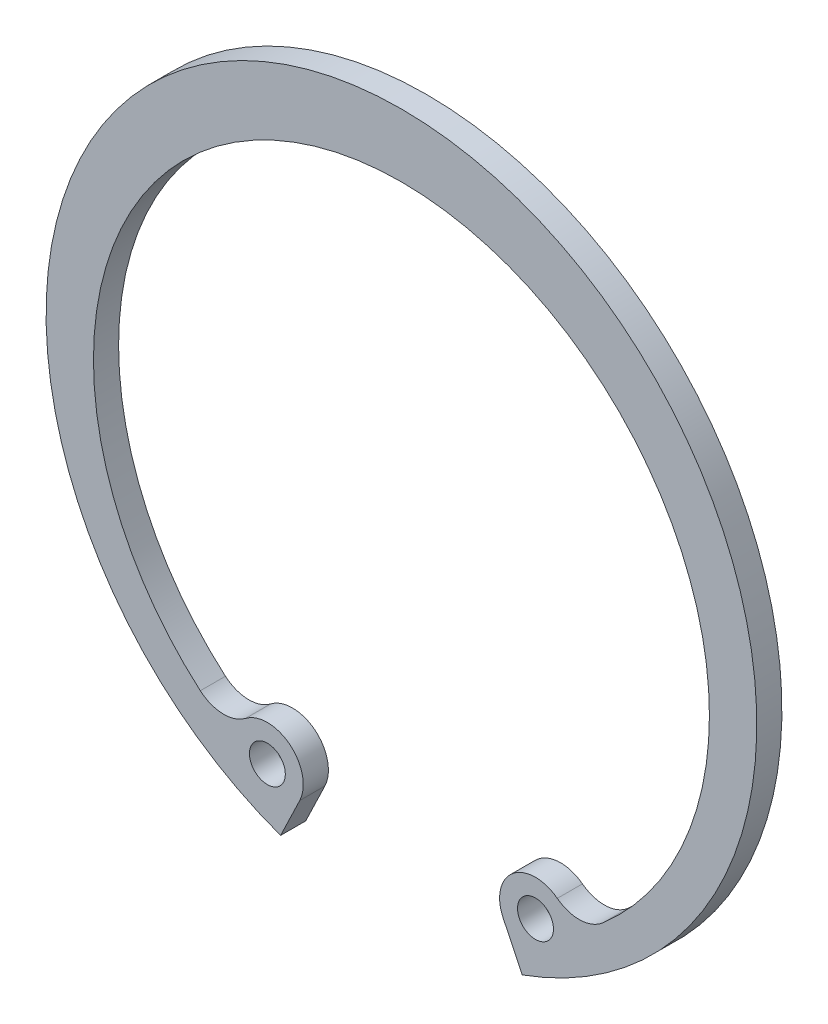
ISO-10303-21;
HEADER;
FILE_DESCRIPTION(('STEP AP214'),'2;1');
FILE_NAME('part.step','',(''),(''),'','','');
FILE_SCHEMA(('AUTOMOTIVE_DESIGN { 1 0 10303 214 1 1 1 1 }'));
ENDSEC;
DATA;
#1=APPLICATION_CONTEXT('core data for automotive mechanical design processes');
#2=APPLICATION_PROTOCOL_DEFINITION('international standard','automotive_design',2000,#1);
#3=PRODUCT_CONTEXT('',#1,'mechanical');
#4=PRODUCT('Part','Part','',(#3));
#5=PRODUCT_RELATED_PRODUCT_CATEGORY('part','',(#4));
#6=PRODUCT_DEFINITION_FORMATION('','',#4);
#7=PRODUCT_DEFINITION_CONTEXT('part definition',#1,'design');
#8=PRODUCT_DEFINITION('design','',#6,#7);
#9=PRODUCT_DEFINITION_SHAPE('','',#8);
#10=(LENGTH_UNIT() NAMED_UNIT(*) SI_UNIT(.MILLI.,.METRE.));
#11=(NAMED_UNIT(*) PLANE_ANGLE_UNIT() SI_UNIT($,.RADIAN.));
#12=(NAMED_UNIT(*) SI_UNIT($,.STERADIAN.) SOLID_ANGLE_UNIT());
#13=UNCERTAINTY_MEASURE_WITH_UNIT(LENGTH_MEASURE(1.E-05),#10,'distance_accuracy_value','');
#14=(GEOMETRIC_REPRESENTATION_CONTEXT(3) GLOBAL_UNCERTAINTY_ASSIGNED_CONTEXT((#13)) GLOBAL_UNIT_ASSIGNED_CONTEXT((#10,
#11,#12)) REPRESENTATION_CONTEXT('',''));
#15=CARTESIAN_POINT('',(0.,0.,0.));
#16=DIRECTION('',(0.,0.,1.));
#17=DIRECTION('',(1.,0.,0.));
#18=AXIS2_PLACEMENT_3D('',#15,#16,#17);
#19=CARTESIAN_POINT('',(-0.0631372709212172,-22.3609285333198,0.));
#20=DIRECTION('',(0.,0.,1.));
#21=DIRECTION('',(1.,0.,0.));
#22=AXIS2_PLACEMENT_3D('',#19,#20,#21);
#23=PLANE('',#22);
#24=CARTESIAN_POINT('',(-9.33661301784131,-41.9224137880717,0.));
#25=DIRECTION('',(0.,0.,1.));
#26=DIRECTION('',(1.,0.,0.));
#27=AXIS2_PLACEMENT_3D('',#24,#25,#26);
#28=CIRCLE('',#27,1.25);
#29=CARTESIAN_POINT('',(-8.08661301784131,-41.9224137880717,0.));
#30=VERTEX_POINT('',#29);
#31=EDGE_CURVE('E131',#30,#30,#28,.T.);
#32=ORIENTED_EDGE('',*,*,#31,.T.);
#33=EDGE_LOOP('',(#32));
#34=FACE_BOUND('',#33,.T.);
#35=CARTESIAN_POINT('',(9.33661301784131,-41.9224137880717,0.));
#36=DIRECTION('',(0.,0.,1.));
#37=DIRECTION('',(1.,0.,0.));
#38=AXIS2_PLACEMENT_3D('',#35,#36,#37);
#39=CIRCLE('',#38,1.25);
#40=CARTESIAN_POINT('',(10.5866130178413,-41.9224137880717,0.));
#41=VERTEX_POINT('',#40);
#42=EDGE_CURVE('E134',#41,#41,#39,.T.);
#43=ORIENTED_EDGE('',*,*,#42,.T.);
#44=EDGE_LOOP('',(#43));
#45=FACE_BOUND('',#44,.T.);
#46=CARTESIAN_POINT('',(-12.3749250098986,-37.9514365482828,0.));
#47=DIRECTION('',(0.,0.,1.));
#48=DIRECTION('',(1.,0.,0.));
#49=AXIS2_PLACEMENT_3D('',#46,#47,#48);
#50=CIRCLE('',#49,2.5);
#51=CARTESIAN_POINT('',(-14.0075008687242,-39.8447659082146,0.));
#52=VERTEX_POINT('',#51);
#53=CARTESIAN_POINT('',(-10.8557690138699,-39.9369251681772,0.));
#54=VERTEX_POINT('',#53);
#55=EDGE_CURVE('E137',#52,#54,#50,.T.);
#56=ORIENTED_EDGE('',*,*,#55,.T.);
#57=CARTESIAN_POINT('',(-9.33661301784131,-41.9224137880717,0.));
#58=DIRECTION('',(0.,0.,1.));
#59=DIRECTION('',(1.,0.,0.));
#60=AXIS2_PLACEMENT_3D('',#57,#58,#59);
#61=CIRCLE('',#60,2.5);
#62=CARTESIAN_POINT('',(-7.08343276400469,-43.0055475488421,0.));
#63=VERTEX_POINT('',#62);
#64=EDGE_CURVE('E139',#63,#54,#61,.T.);
#65=ORIENTED_EDGE('',*,*,#64,.F.);
#66=DIRECTION('',(0.43325350430818,0.901272101534649,0.));
#67=VECTOR('',#66,1.);
#68=CARTESIAN_POINT('',(-7.08343276400469,-43.0055475488421,0.));
#69=LINE('',#68,#67);
#70=CARTESIAN_POINT('',(-8.415,-45.7755295321073,0.));
#71=VERTEX_POINT('',#70);
#72=EDGE_CURVE('E104',#71,#63,#69,.T.);
#73=ORIENTED_EDGE('',*,*,#72,.F.);
#74=CARTESIAN_POINT('',(0.,-22.5,0.));
#75=DIRECTION('',(0.,0.,1.));
#76=DIRECTION('',(1.,0.,0.));
#77=AXIS2_PLACEMENT_3D('',#74,#75,#76);
#78=CIRCLE('',#77,24.75);
#79=CARTESIAN_POINT('',(8.41500000000001,-45.7755295321073,0.));
#80=VERTEX_POINT('',#79);
#81=EDGE_CURVE('E141',#80,#71,#78,.T.);
#82=ORIENTED_EDGE('',*,*,#81,.F.);
#83=DIRECTION('',(0.43325350430818,-0.901272101534649,0.));
#84=VECTOR('',#83,1.);
#85=CARTESIAN_POINT('',(8.415,-45.7755295321073,0.));
#86=LINE('',#85,#84);
#87=CARTESIAN_POINT('',(7.08343276400471,-43.0055475488421,0.));
#88=VERTEX_POINT('',#87);
#89=EDGE_CURVE('E108',#88,#80,#86,.T.);
#90=ORIENTED_EDGE('',*,*,#89,.F.);
#91=CARTESIAN_POINT('',(9.33661301784131,-41.9224137880717,0.));
#92=DIRECTION('',(0.,0.,1.));
#93=DIRECTION('',(1.,0.,0.));
#94=AXIS2_PLACEMENT_3D('',#91,#92,#93);
#95=CIRCLE('',#94,2.5);
#96=CARTESIAN_POINT('',(10.8557690138699,-39.9369251681772,0.));
#97=VERTEX_POINT('',#96);
#98=EDGE_CURVE('E84',#97,#88,#95,.T.);
#99=ORIENTED_EDGE('',*,*,#98,.F.);
#100=CARTESIAN_POINT('',(12.3749250098986,-37.9514365482828,0.));
#101=DIRECTION('',(0.,0.,1.));
#102=DIRECTION('',(1.,0.,0.));
#103=AXIS2_PLACEMENT_3D('',#100,#101,#102);
#104=CIRCLE('',#103,2.5);
#105=CARTESIAN_POINT('',(14.0075008687242,-39.8447659082146,0.));
#106=VERTEX_POINT('',#105);
#107=EDGE_CURVE('E80',#97,#106,#104,.T.);
#108=ORIENTED_EDGE('',*,*,#107,.T.);
#109=CARTESIAN_POINT('',(0.,-23.6,0.));
#110=DIRECTION('',(0.,0.,1.));
#111=DIRECTION('',(1.,0.,0.));
#112=AXIS2_PLACEMENT_3D('',#109,#110,#111);
#113=CIRCLE('',#112,21.45);
#114=EDGE_CURVE('E20',#106,#52,#113,.T.);
#115=ORIENTED_EDGE('',*,*,#114,.T.);
#116=EDGE_LOOP('',(#56,#65,#73,#82,#90,#99,#108,#115));
#117=FACE_BOUND('',#116,.T.);
#118=ADVANCED_FACE('F17',(#34,#45,#117),#23,.F.);
#119=CARTESIAN_POINT('',(0.,-23.6,0.));
#120=DIRECTION('',(0.,0.,1.));
#121=DIRECTION('',(1.,0.,0.));
#122=AXIS2_PLACEMENT_3D('',#119,#120,#121);
#123=CYLINDRICAL_SURFACE('',#122,21.45);
#124=DIRECTION('',(0.,0.,1.));
#125=VECTOR('',#124,1.);
#126=CARTESIAN_POINT('',(-14.0075008687242,-39.8447659082146,0.));
#127=LINE('',#126,#125);
#128=CARTESIAN_POINT('',(-14.0075008687242,-39.8447659082146,1.75));
#129=VERTEX_POINT('',#128);
#130=EDGE_CURVE('E93',#129,#52,#127,.F.);
#131=ORIENTED_EDGE('',*,*,#130,.T.);
#132=ORIENTED_EDGE('',*,*,#114,.F.);
#133=DIRECTION('',(0.,0.,1.));
#134=VECTOR('',#133,1.);
#135=CARTESIAN_POINT('',(14.0075008687242,-39.8447659082146,0.));
#136=LINE('',#135,#134);
#137=CARTESIAN_POINT('',(14.0075008687242,-39.8447659082146,1.75));
#138=VERTEX_POINT('',#137);
#139=EDGE_CURVE('E88',#106,#138,#136,.T.);
#140=ORIENTED_EDGE('',*,*,#139,.T.);
#141=CARTESIAN_POINT('',(0.,-23.6,1.75));
#142=DIRECTION('',(0.,0.,1.));
#143=DIRECTION('',(1.,0.,0.));
#144=AXIS2_PLACEMENT_3D('',#141,#142,#143);
#145=CIRCLE('',#144,21.45);
#146=EDGE_CURVE('E129',#129,#138,#145,.F.);
#147=ORIENTED_EDGE('',*,*,#146,.F.);
#148=EDGE_LOOP('',(#131,#132,#140,#147));
#149=FACE_BOUND('',#148,.T.);
#150=ADVANCED_FACE('F90',(#149),#123,.F.);
#151=CARTESIAN_POINT('',(12.3749250098986,-37.9514365482828,0.));
#152=DIRECTION('',(0.,0.,1.));
#153=DIRECTION('',(1.,0.,0.));
#154=AXIS2_PLACEMENT_3D('',#151,#152,#153);
#155=CYLINDRICAL_SURFACE('',#154,2.5);
#156=ORIENTED_EDGE('',*,*,#139,.F.);
#157=ORIENTED_EDGE('',*,*,#107,.F.);
#158=DIRECTION('',(0.,0.,1.));
#159=VECTOR('',#158,1.);
#160=CARTESIAN_POINT('',(10.8557690138699,-39.9369251681772,0.));
#161=LINE('',#160,#159);
#162=CARTESIAN_POINT('',(10.8557690138699,-39.9369251681773,1.75));
#163=VERTEX_POINT('',#162);
#164=EDGE_CURVE('E99',#163,#97,#161,.F.);
#165=ORIENTED_EDGE('',*,*,#164,.F.);
#166=CARTESIAN_POINT('',(12.3749250098986,-37.9514365482828,1.75));
#167=DIRECTION('',(0.,0.,1.));
#168=DIRECTION('',(1.,0.,0.));
#169=AXIS2_PLACEMENT_3D('',#166,#167,#168);
#170=CIRCLE('',#169,2.5);
#171=EDGE_CURVE('E97',#138,#163,#170,.F.);
#172=ORIENTED_EDGE('',*,*,#171,.F.);
#173=EDGE_LOOP('',(#156,#157,#165,#172));
#174=FACE_BOUND('',#173,.T.);
#175=ADVANCED_FACE('F95',(#174),#155,.F.);
#176=CARTESIAN_POINT('',(9.33661301784131,-41.9224137880717,0.));
#177=DIRECTION('',(0.,0.,1.));
#178=DIRECTION('',(1.,0.,0.));
#179=AXIS2_PLACEMENT_3D('',#176,#177,#178);
#180=CYLINDRICAL_SURFACE('',#179,2.5);
#181=ORIENTED_EDGE('',*,*,#98,.T.);
#182=DIRECTION('',(0.,0.,1.));
#183=VECTOR('',#182,1.);
#184=CARTESIAN_POINT('',(7.0834327640047,-43.0055475488421,0.));
#185=LINE('',#184,#183);
#186=CARTESIAN_POINT('',(7.0834327640047,-43.0055475488421,1.75));
#187=VERTEX_POINT('',#186);
#188=EDGE_CURVE('E110',#187,#88,#185,.F.);
#189=ORIENTED_EDGE('',*,*,#188,.F.);
#190=CARTESIAN_POINT('',(9.33661301784131,-41.9224137880717,1.75));
#191=DIRECTION('',(0.,0.,1.));
#192=DIRECTION('',(1.,0.,0.));
#193=AXIS2_PLACEMENT_3D('',#190,#191,#192);
#194=CIRCLE('',#193,2.5);
#195=EDGE_CURVE('E125',#163,#187,#194,.T.);
#196=ORIENTED_EDGE('',*,*,#195,.F.);
#197=ORIENTED_EDGE('',*,*,#164,.T.);
#198=EDGE_LOOP('',(#181,#189,#196,#197));
#199=FACE_BOUND('',#198,.T.);
#200=ADVANCED_FACE('F211',(#199),#180,.T.);
#201=CARTESIAN_POINT('',(8.415,-45.7755295321073,0.));
#202=DIRECTION('',(-0.901272101534649,-0.43325350430818,0.));
#203=DIRECTION('',(0.43325350430818,-0.901272101534649,0.));
#204=AXIS2_PLACEMENT_3D('',#201,#202,#203);
#205=PLANE('',#204);
#206=ORIENTED_EDGE('',*,*,#89,.T.);
#207=DIRECTION('',(0.,0.,1.));
#208=VECTOR('',#207,1.);
#209=CARTESIAN_POINT('',(8.415,-45.7755295321073,0.));
#210=LINE('',#209,#208);
#211=CARTESIAN_POINT('',(8.41500000000001,-45.7755295321073,1.75));
#212=VERTEX_POINT('',#211);
#213=EDGE_CURVE('E109',#212,#80,#210,.F.);
#214=ORIENTED_EDGE('',*,*,#213,.F.);
#215=DIRECTION('',(0.433253504308182,-0.901272101534648,0.));
#216=VECTOR('',#215,1.);
#217=CARTESIAN_POINT('',(7.08343276400469,-43.0055475488421,1.75));
#218=LINE('',#217,#216);
#219=EDGE_CURVE('E124',#187,#212,#218,.T.);
#220=ORIENTED_EDGE('',*,*,#219,.F.);
#221=ORIENTED_EDGE('',*,*,#188,.T.);
#222=EDGE_LOOP('',(#206,#214,#220,#221));
#223=FACE_BOUND('',#222,.T.);
#224=ADVANCED_FACE('F216',(#223),#205,.T.);
#225=CARTESIAN_POINT('',(0.,-22.5,0.));
#226=DIRECTION('',(0.,0.,1.));
#227=DIRECTION('',(1.,0.,0.));
#228=AXIS2_PLACEMENT_3D('',#225,#226,#227);
#229=CYLINDRICAL_SURFACE('',#228,24.75);
#230=ORIENTED_EDGE('',*,*,#81,.T.);
#231=DIRECTION('',(0.,0.,1.));
#232=VECTOR('',#231,1.);
#233=CARTESIAN_POINT('',(-8.41499999999999,-45.7755295321073,0.));
#234=LINE('',#233,#232);
#235=CARTESIAN_POINT('',(-8.415,-45.7755295321073,1.75));
#236=VERTEX_POINT('',#235);
#237=EDGE_CURVE('E107',#236,#71,#234,.F.);
#238=ORIENTED_EDGE('',*,*,#237,.F.);
#239=CARTESIAN_POINT('',(0.,-22.5,1.75));
#240=DIRECTION('',(0.,0.,1.));
#241=DIRECTION('',(1.,0.,0.));
#242=AXIS2_PLACEMENT_3D('',#239,#240,#241);
#243=CIRCLE('',#242,24.75);
#244=EDGE_CURVE('E121',#212,#236,#243,.T.);
#245=ORIENTED_EDGE('',*,*,#244,.F.);
#246=ORIENTED_EDGE('',*,*,#213,.T.);
#247=EDGE_LOOP('',(#230,#238,#245,#246));
#248=FACE_BOUND('',#247,.T.);
#249=ADVANCED_FACE('F179',(#248),#229,.T.);
#250=CARTESIAN_POINT('',(-7.08343276400469,-43.0055475488421,0.));
#251=DIRECTION('',(0.901272101534649,-0.43325350430818,0.));
#252=DIRECTION('',(0.43325350430818,0.901272101534649,0.));
#253=AXIS2_PLACEMENT_3D('',#250,#251,#252);
#254=PLANE('',#253);
#255=ORIENTED_EDGE('',*,*,#72,.T.);
#256=DIRECTION('',(0.,0.,1.));
#257=VECTOR('',#256,1.);
#258=CARTESIAN_POINT('',(-7.08343276400467,-43.0055475488421,0.));
#259=LINE('',#258,#257);
#260=CARTESIAN_POINT('',(-7.08343276400469,-43.0055475488421,1.75));
#261=VERTEX_POINT('',#260);
#262=EDGE_CURVE('E106',#261,#63,#259,.F.);
#263=ORIENTED_EDGE('',*,*,#262,.F.);
#264=DIRECTION('',(0.433253504308182,0.901272101534648,0.));
#265=VECTOR('',#264,1.);
#266=CARTESIAN_POINT('',(-8.415,-45.7755295321073,1.75));
#267=LINE('',#266,#265);
#268=EDGE_CURVE('E120',#236,#261,#267,.T.);
#269=ORIENTED_EDGE('',*,*,#268,.F.);
#270=ORIENTED_EDGE('',*,*,#237,.T.);
#271=EDGE_LOOP('',(#255,#263,#269,#270));
#272=FACE_BOUND('',#271,.T.);
#273=ADVANCED_FACE('F164',(#272),#254,.T.);
#274=CARTESIAN_POINT('',(-9.33661301784131,-41.9224137880717,0.));
#275=DIRECTION('',(0.,0.,1.));
#276=DIRECTION('',(1.,0.,0.));
#277=AXIS2_PLACEMENT_3D('',#274,#275,#276);
#278=CYLINDRICAL_SURFACE('',#277,2.5);
#279=ORIENTED_EDGE('',*,*,#64,.T.);
#280=DIRECTION('',(0.,0.,1.));
#281=VECTOR('',#280,1.);
#282=CARTESIAN_POINT('',(-10.8557690138699,-39.9369251681772,0.));
#283=LINE('',#282,#281);
#284=CARTESIAN_POINT('',(-10.8557690138699,-39.9369251681772,1.75));
#285=VERTEX_POINT('',#284);
#286=EDGE_CURVE('E35',#54,#285,#283,.T.);
#287=ORIENTED_EDGE('',*,*,#286,.T.);
#288=CARTESIAN_POINT('',(-9.33661301784131,-41.9224137880717,1.75));
#289=DIRECTION('',(0.,0.,1.));
#290=DIRECTION('',(1.,0.,0.));
#291=AXIS2_PLACEMENT_3D('',#288,#289,#290);
#292=CIRCLE('',#291,2.5);
#293=EDGE_CURVE('E117',#261,#285,#292,.T.);
#294=ORIENTED_EDGE('',*,*,#293,.F.);
#295=ORIENTED_EDGE('',*,*,#262,.T.);
#296=EDGE_LOOP('',(#279,#287,#294,#295));
#297=FACE_BOUND('',#296,.T.);
#298=ADVANCED_FACE('F167',(#297),#278,.T.);
#299=CARTESIAN_POINT('',(-12.3749250098986,-37.9514365482828,0.));
#300=DIRECTION('',(0.,0.,1.));
#301=DIRECTION('',(1.,0.,0.));
#302=AXIS2_PLACEMENT_3D('',#299,#300,#301);
#303=CYLINDRICAL_SURFACE('',#302,2.5);
#304=ORIENTED_EDGE('',*,*,#286,.F.);
#305=ORIENTED_EDGE('',*,*,#55,.F.);
#306=ORIENTED_EDGE('',*,*,#130,.F.);
#307=CARTESIAN_POINT('',(-12.3749250098986,-37.9514365482828,1.75));
#308=DIRECTION('',(0.,0.,1.));
#309=DIRECTION('',(1.,0.,0.));
#310=AXIS2_PLACEMENT_3D('',#307,#308,#309);
#311=CIRCLE('',#310,2.5);
#312=EDGE_CURVE('E114',#285,#129,#311,.F.);
#313=ORIENTED_EDGE('',*,*,#312,.F.);
#314=EDGE_LOOP('',(#304,#305,#306,#313));
#315=FACE_BOUND('',#314,.T.);
#316=ADVANCED_FACE('F169',(#315),#303,.F.);
#317=CARTESIAN_POINT('',(9.33661301784131,-41.9224137880717,0.));
#318=DIRECTION('',(0.,0.,1.));
#319=DIRECTION('',(1.,0.,0.));
#320=AXIS2_PLACEMENT_3D('',#317,#318,#319);
#321=CYLINDRICAL_SURFACE('',#320,1.25);
#322=ORIENTED_EDGE('',*,*,#42,.F.);
#323=EDGE_LOOP('',(#322));
#324=FACE_BOUND('',#323,.T.);
#325=CARTESIAN_POINT('',(9.33661301784131,-41.9224137880717,1.75));
#326=DIRECTION('',(0.,0.,1.));
#327=DIRECTION('',(1.,0.,0.));
#328=AXIS2_PLACEMENT_3D('',#325,#326,#327);
#329=CIRCLE('',#328,1.25);
#330=CARTESIAN_POINT('',(10.5866130178413,-41.9224137880717,1.75));
#331=VERTEX_POINT('',#330);
#332=EDGE_CURVE('E26',#331,#331,#329,.F.);
#333=ORIENTED_EDGE('',*,*,#332,.F.);
#334=EDGE_LOOP('',(#333));
#335=FACE_BOUND('',#334,.T.);
#336=ADVANCED_FACE('F176',(#324,#335),#321,.F.);
#337=CARTESIAN_POINT('',(-9.33661301784131,-41.9224137880717,0.));
#338=DIRECTION('',(0.,0.,1.));
#339=DIRECTION('',(1.,0.,0.));
#340=AXIS2_PLACEMENT_3D('',#337,#338,#339);
#341=CYLINDRICAL_SURFACE('',#340,1.25);
#342=ORIENTED_EDGE('',*,*,#31,.F.);
#343=EDGE_LOOP('',(#342));
#344=FACE_BOUND('',#343,.T.);
#345=CARTESIAN_POINT('',(-9.33661301784131,-41.9224137880717,1.75));
#346=DIRECTION('',(0.,0.,1.));
#347=DIRECTION('',(1.,0.,0.));
#348=AXIS2_PLACEMENT_3D('',#345,#346,#347);
#349=CIRCLE('',#348,1.25);
#350=CARTESIAN_POINT('',(-8.08661301784131,-41.9224137880717,1.75));
#351=VERTEX_POINT('',#350);
#352=EDGE_CURVE('E11',#351,#351,#349,.F.);
#353=ORIENTED_EDGE('',*,*,#352,.F.);
#354=EDGE_LOOP('',(#353));
#355=FACE_BOUND('',#354,.T.);
#356=ADVANCED_FACE('F182',(#344,#355),#341,.F.);
#357=CARTESIAN_POINT('',(-0.0631372709212169,-22.3609285333198,1.75));
#358=DIRECTION('',(0.,0.,1.));
#359=DIRECTION('',(1.,0.,0.));
#360=AXIS2_PLACEMENT_3D('',#357,#358,#359);
#361=PLANE('',#360);
#362=ORIENTED_EDGE('',*,*,#352,.T.);
#363=EDGE_LOOP('',(#362));
#364=FACE_BOUND('',#363,.T.);
#365=ORIENTED_EDGE('',*,*,#332,.T.);
#366=EDGE_LOOP('',(#365));
#367=FACE_BOUND('',#366,.T.);
#368=ORIENTED_EDGE('',*,*,#293,.T.);
#369=ORIENTED_EDGE('',*,*,#312,.T.);
#370=ORIENTED_EDGE('',*,*,#146,.T.);
#371=ORIENTED_EDGE('',*,*,#171,.T.);
#372=ORIENTED_EDGE('',*,*,#195,.T.);
#373=ORIENTED_EDGE('',*,*,#219,.T.);
#374=ORIENTED_EDGE('',*,*,#244,.T.);
#375=ORIENTED_EDGE('',*,*,#268,.T.);
#376=EDGE_LOOP('',(#368,#369,#370,#371,#372,#373,#374,#375));
#377=FACE_BOUND('',#376,.T.);
#378=ADVANCED_FACE('F161',(#364,#367,#377),#361,.T.);
#379=CLOSED_SHELL('',(#118,#150,#175,#200,#224,#249,#273,#298,#316,#336,#356,#378));
#380=MANIFOLD_SOLID_BREP('B1',#379);
#381=ADVANCED_BREP_SHAPE_REPRESENTATION('',(#18,#380),#14);
#382=SHAPE_DEFINITION_REPRESENTATION(#9,#381);
ENDSEC;
END-ISO-10303-21;
